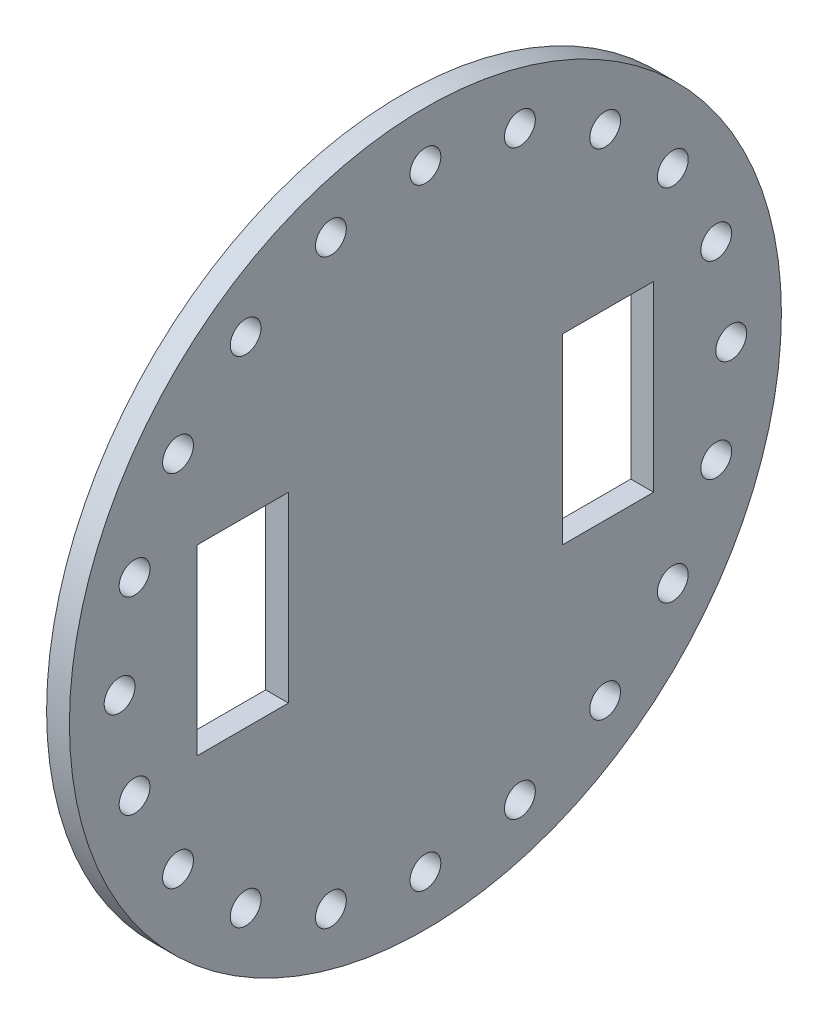
ISO-10303-21;
HEADER;
FILE_DESCRIPTION(('STEP AP214'),'2;1');
FILE_NAME('part.step','',(''),(''),'','','');
FILE_SCHEMA(('AUTOMOTIVE_DESIGN { 1 0 10303 214 1 1 1 1 }'));
ENDSEC;
DATA;
#1=APPLICATION_CONTEXT('core data for automotive mechanical design processes');
#2=APPLICATION_PROTOCOL_DEFINITION('international standard','automotive_design',2000,#1);
#3=PRODUCT_CONTEXT('',#1,'mechanical');
#4=PRODUCT('Part','Part','',(#3));
#5=PRODUCT_RELATED_PRODUCT_CATEGORY('part','',(#4));
#6=PRODUCT_DEFINITION_FORMATION('','',#4);
#7=PRODUCT_DEFINITION_CONTEXT('part definition',#1,'design');
#8=PRODUCT_DEFINITION('design','',#6,#7);
#9=PRODUCT_DEFINITION_SHAPE('','',#8);
#10=(LENGTH_UNIT() NAMED_UNIT(*) SI_UNIT(.MILLI.,.METRE.));
#11=(NAMED_UNIT(*) PLANE_ANGLE_UNIT() SI_UNIT($,.RADIAN.));
#12=(NAMED_UNIT(*) SI_UNIT($,.STERADIAN.) SOLID_ANGLE_UNIT());
#13=UNCERTAINTY_MEASURE_WITH_UNIT(LENGTH_MEASURE(1.E-05),#10,'distance_accuracy_value','');
#14=(GEOMETRIC_REPRESENTATION_CONTEXT(3) GLOBAL_UNCERTAINTY_ASSIGNED_CONTEXT((#13)) GLOBAL_UNIT_ASSIGNED_CONTEXT((#10,
#11,#12)) REPRESENTATION_CONTEXT('',''));
#15=CARTESIAN_POINT('',(0.,0.,0.));
#16=DIRECTION('',(0.,0.,1.));
#17=DIRECTION('',(1.,0.,0.));
#18=AXIS2_PLACEMENT_3D('',#15,#16,#17);
#19=CARTESIAN_POINT('',(10.,-40.,0.));
#20=DIRECTION('',(0.,1.,0.));
#21=DIRECTION('',(0.,0.,1.));
#22=AXIS2_PLACEMENT_3D('',#19,#20,#21);
#23=PLANE('',#22);
#24=DIRECTION('',(0.,0.,-1.));
#25=VECTOR('',#24,1.);
#26=CARTESIAN_POINT('',(0.,-40.,0.));
#27=LINE('',#26,#25);
#28=CARTESIAN_POINT('',(0.,-40.,100.));
#29=VERTEX_POINT('',#28);
#30=CARTESIAN_POINT('',(0.,-40.,60.));
#31=VERTEX_POINT('',#30);
#32=EDGE_CURVE('E211',#29,#31,#27,.T.);
#33=ORIENTED_EDGE('',*,*,#32,.F.);
#34=DIRECTION('',(-1.,0.,0.));
#35=VECTOR('',#34,1.);
#36=CARTESIAN_POINT('',(10.,-40.,100.));
#37=LINE('',#36,#35);
#38=CARTESIAN_POINT('',(10.,-40.,100.));
#39=VERTEX_POINT('',#38);
#40=EDGE_CURVE('E11',#39,#29,#37,.T.);
#41=ORIENTED_EDGE('',*,*,#40,.F.);
#42=DIRECTION('',(0.,0.,-1.));
#43=VECTOR('',#42,1.);
#44=CARTESIAN_POINT('',(10.,-40.,0.));
#45=LINE('',#44,#43);
#46=CARTESIAN_POINT('',(10.,-40.,60.));
#47=VERTEX_POINT('',#46);
#48=EDGE_CURVE('E128',#39,#47,#45,.T.);
#49=ORIENTED_EDGE('',*,*,#48,.T.);
#50=DIRECTION('',(-1.,0.,0.));
#51=VECTOR('',#50,1.);
#52=CARTESIAN_POINT('',(10.,-40.,60.));
#53=LINE('',#52,#51);
#54=EDGE_CURVE('E89',#47,#31,#53,.T.);
#55=ORIENTED_EDGE('',*,*,#54,.T.);
#56=EDGE_LOOP('',(#33,#41,#49,#55));
#57=FACE_BOUND('',#56,.T.);
#58=ADVANCED_FACE('F35',(#57),#23,.T.);
#59=CARTESIAN_POINT('',(10.,0.,100.));
#60=DIRECTION('',(0.,0.,-1.));
#61=DIRECTION('',(-1.,0.,0.));
#62=AXIS2_PLACEMENT_3D('',#59,#60,#61);
#63=PLANE('',#62);
#64=DIRECTION('',(0.,-1.,0.));
#65=VECTOR('',#64,1.);
#66=CARTESIAN_POINT('',(0.,0.,100.));
#67=LINE('',#66,#65);
#68=CARTESIAN_POINT('',(0.,40.,100.));
#69=VERTEX_POINT('',#68);
#70=EDGE_CURVE('E117',#69,#29,#67,.T.);
#71=ORIENTED_EDGE('',*,*,#70,.F.);
#72=DIRECTION('',(-1.,0.,0.));
#73=VECTOR('',#72,1.);
#74=CARTESIAN_POINT('',(10.,40.,100.));
#75=LINE('',#74,#73);
#76=CARTESIAN_POINT('',(10.,40.,100.));
#77=VERTEX_POINT('',#76);
#78=EDGE_CURVE('E45',#77,#69,#75,.T.);
#79=ORIENTED_EDGE('',*,*,#78,.F.);
#80=DIRECTION('',(0.,-1.,0.));
#81=VECTOR('',#80,1.);
#82=CARTESIAN_POINT('',(10.,0.,100.));
#83=LINE('',#82,#81);
#84=EDGE_CURVE('E115',#77,#39,#83,.T.);
#85=ORIENTED_EDGE('',*,*,#84,.T.);
#86=ORIENTED_EDGE('',*,*,#40,.T.);
#87=EDGE_LOOP('',(#71,#79,#85,#86));
#88=FACE_BOUND('',#87,.T.);
#89=ADVANCED_FACE('F113',(#88),#63,.T.);
#90=CARTESIAN_POINT('',(10.,40.,0.));
#91=DIRECTION('',(0.,1.,0.));
#92=DIRECTION('',(0.,0.,1.));
#93=AXIS2_PLACEMENT_3D('',#90,#91,#92);
#94=PLANE('',#93);
#95=DIRECTION('',(0.,0.,-1.));
#96=VECTOR('',#95,1.);
#97=CARTESIAN_POINT('',(0.,40.,0.));
#98=LINE('',#97,#96);
#99=CARTESIAN_POINT('',(0.,40.,60.));
#100=VERTEX_POINT('',#99);
#101=EDGE_CURVE('E214',#69,#100,#98,.T.);
#102=ORIENTED_EDGE('',*,*,#101,.T.);
#103=DIRECTION('',(-1.,0.,0.));
#104=VECTOR('',#103,1.);
#105=CARTESIAN_POINT('',(10.,40.,60.));
#106=LINE('',#105,#104);
#107=CARTESIAN_POINT('',(10.,40.,60.));
#108=VERTEX_POINT('',#107);
#109=EDGE_CURVE('E120',#108,#100,#106,.T.);
#110=ORIENTED_EDGE('',*,*,#109,.F.);
#111=DIRECTION('',(0.,0.,-1.));
#112=VECTOR('',#111,1.);
#113=CARTESIAN_POINT('',(10.,40.,0.));
#114=LINE('',#113,#112);
#115=EDGE_CURVE('E123',#77,#108,#114,.T.);
#116=ORIENTED_EDGE('',*,*,#115,.F.);
#117=ORIENTED_EDGE('',*,*,#78,.T.);
#118=EDGE_LOOP('',(#102,#110,#116,#117));
#119=FACE_BOUND('',#118,.T.);
#120=ADVANCED_FACE('F124',(#119),#94,.F.);
#121=CARTESIAN_POINT('',(10.,0.,-60.));
#122=DIRECTION('',(0.,0.,-1.));
#123=DIRECTION('',(-1.,0.,0.));
#124=AXIS2_PLACEMENT_3D('',#121,#122,#123);
#125=PLANE('',#124);
#126=DIRECTION('',(0.,-1.,0.));
#127=VECTOR('',#126,1.);
#128=CARTESIAN_POINT('',(0.,0.,-60.));
#129=LINE('',#128,#127);
#130=CARTESIAN_POINT('',(0.,40.,-60.));
#131=VERTEX_POINT('',#130);
#132=CARTESIAN_POINT('',(0.,-40.,-60.));
#133=VERTEX_POINT('',#132);
#134=EDGE_CURVE('E199',#131,#133,#129,.T.);
#135=ORIENTED_EDGE('',*,*,#134,.F.);
#136=DIRECTION('',(-1.,0.,0.));
#137=VECTOR('',#136,1.);
#138=CARTESIAN_POINT('',(10.,40.,-60.));
#139=LINE('',#138,#137);
#140=CARTESIAN_POINT('',(10.,40.,-60.));
#141=VERTEX_POINT('',#140);
#142=EDGE_CURVE('E39',#141,#131,#139,.T.);
#143=ORIENTED_EDGE('',*,*,#142,.F.);
#144=DIRECTION('',(0.,-1.,0.));
#145=VECTOR('',#144,1.);
#146=CARTESIAN_POINT('',(10.,0.,-60.));
#147=LINE('',#146,#145);
#148=CARTESIAN_POINT('',(10.,-40.,-60.));
#149=VERTEX_POINT('',#148);
#150=EDGE_CURVE('E248',#141,#149,#147,.T.);
#151=ORIENTED_EDGE('',*,*,#150,.T.);
#152=DIRECTION('',(-1.,0.,0.));
#153=VECTOR('',#152,1.);
#154=CARTESIAN_POINT('',(10.,-40.,-60.));
#155=LINE('',#154,#153);
#156=EDGE_CURVE('E138',#149,#133,#155,.T.);
#157=ORIENTED_EDGE('',*,*,#156,.T.);
#158=EDGE_LOOP('',(#135,#143,#151,#157));
#159=FACE_BOUND('',#158,.T.);
#160=ADVANCED_FACE('F236',(#159),#125,.T.);
#161=CARTESIAN_POINT('',(10.,40.,0.));
#162=DIRECTION('',(0.,-1.,0.));
#163=DIRECTION('',(0.,0.,-1.));
#164=AXIS2_PLACEMENT_3D('',#161,#162,#163);
#165=PLANE('',#164);
#166=DIRECTION('',(0.,0.,1.));
#167=VECTOR('',#166,1.);
#168=CARTESIAN_POINT('',(0.,40.,0.));
#169=LINE('',#168,#167);
#170=CARTESIAN_POINT('',(0.,40.,-100.));
#171=VERTEX_POINT('',#170);
#172=EDGE_CURVE('E202',#171,#131,#169,.T.);
#173=ORIENTED_EDGE('',*,*,#172,.F.);
#174=DIRECTION('',(-1.,0.,0.));
#175=VECTOR('',#174,1.);
#176=CARTESIAN_POINT('',(10.,40.,-100.));
#177=LINE('',#176,#175);
#178=CARTESIAN_POINT('',(10.,40.,-100.));
#179=VERTEX_POINT('',#178);
#180=EDGE_CURVE('E226',#179,#171,#177,.T.);
#181=ORIENTED_EDGE('',*,*,#180,.F.);
#182=DIRECTION('',(0.,0.,1.));
#183=VECTOR('',#182,1.);
#184=CARTESIAN_POINT('',(10.,40.,0.));
#185=LINE('',#184,#183);
#186=EDGE_CURVE('E235',#179,#141,#185,.T.);
#187=ORIENTED_EDGE('',*,*,#186,.T.);
#188=ORIENTED_EDGE('',*,*,#142,.T.);
#189=EDGE_LOOP('',(#173,#181,#187,#188));
#190=FACE_BOUND('',#189,.T.);
#191=ADVANCED_FACE('F233',(#190),#165,.T.);
#192=CARTESIAN_POINT('',(10.,0.,-100.));
#193=DIRECTION('',(0.,0.,-1.));
#194=DIRECTION('',(-1.,0.,0.));
#195=AXIS2_PLACEMENT_3D('',#192,#193,#194);
#196=PLANE('',#195);
#197=DIRECTION('',(0.,-1.,0.));
#198=VECTOR('',#197,1.);
#199=CARTESIAN_POINT('',(0.,0.,-100.));
#200=LINE('',#199,#198);
#201=CARTESIAN_POINT('',(0.,-40.,-100.));
#202=VERTEX_POINT('',#201);
#203=EDGE_CURVE('E205',#171,#202,#200,.T.);
#204=ORIENTED_EDGE('',*,*,#203,.T.);
#205=DIRECTION('',(-1.,0.,0.));
#206=VECTOR('',#205,1.);
#207=CARTESIAN_POINT('',(10.,-40.,-100.));
#208=LINE('',#207,#206);
#209=CARTESIAN_POINT('',(10.,-40.,-100.));
#210=VERTEX_POINT('',#209);
#211=EDGE_CURVE('E224',#210,#202,#208,.T.);
#212=ORIENTED_EDGE('',*,*,#211,.F.);
#213=DIRECTION('',(0.,-1.,0.));
#214=VECTOR('',#213,1.);
#215=CARTESIAN_POINT('',(10.,0.,-100.));
#216=LINE('',#215,#214);
#217=EDGE_CURVE('E243',#179,#210,#216,.T.);
#218=ORIENTED_EDGE('',*,*,#217,.F.);
#219=ORIENTED_EDGE('',*,*,#180,.T.);
#220=EDGE_LOOP('',(#204,#212,#218,#219));
#221=FACE_BOUND('',#220,.T.);
#222=ADVANCED_FACE('F241',(#221),#196,.F.);
#223=CARTESIAN_POINT('',(10.,0.,60.));
#224=DIRECTION('',(0.,0.,-1.));
#225=DIRECTION('',(-1.,0.,0.));
#226=AXIS2_PLACEMENT_3D('',#223,#224,#225);
#227=PLANE('',#226);
#228=DIRECTION('',(0.,-1.,0.));
#229=VECTOR('',#228,1.);
#230=CARTESIAN_POINT('',(0.,0.,60.));
#231=LINE('',#230,#229);
#232=EDGE_CURVE('E82',#100,#31,#231,.T.);
#233=ORIENTED_EDGE('',*,*,#232,.T.);
#234=ORIENTED_EDGE('',*,*,#54,.F.);
#235=DIRECTION('',(0.,-1.,0.));
#236=VECTOR('',#235,1.);
#237=CARTESIAN_POINT('',(10.,0.,60.));
#238=LINE('',#237,#236);
#239=EDGE_CURVE('E54',#108,#47,#238,.T.);
#240=ORIENTED_EDGE('',*,*,#239,.F.);
#241=ORIENTED_EDGE('',*,*,#109,.T.);
#242=EDGE_LOOP('',(#233,#234,#240,#241));
#243=FACE_BOUND('',#242,.T.);
#244=ADVANCED_FACE('F380',(#243),#227,.F.);
#245=CARTESIAN_POINT('',(10.,-40.,0.));
#246=DIRECTION('',(0.,-1.,0.));
#247=DIRECTION('',(0.,0.,-1.));
#248=AXIS2_PLACEMENT_3D('',#245,#246,#247);
#249=PLANE('',#248);
#250=DIRECTION('',(0.,0.,1.));
#251=VECTOR('',#250,1.);
#252=CARTESIAN_POINT('',(0.,-40.,0.));
#253=LINE('',#252,#251);
#254=EDGE_CURVE('E208',#202,#133,#253,.T.);
#255=ORIENTED_EDGE('',*,*,#254,.T.);
#256=ORIENTED_EDGE('',*,*,#156,.F.);
#257=DIRECTION('',(0.,0.,1.));
#258=VECTOR('',#257,1.);
#259=CARTESIAN_POINT('',(10.,-40.,0.));
#260=LINE('',#259,#258);
#261=EDGE_CURVE('E130',#210,#149,#260,.T.);
#262=ORIENTED_EDGE('',*,*,#261,.F.);
#263=ORIENTED_EDGE('',*,*,#211,.T.);
#264=EDGE_LOOP('',(#255,#256,#262,#263));
#265=FACE_BOUND('',#264,.T.);
#266=ADVANCED_FACE('F245',(#265),#249,.F.);
#267=CARTESIAN_POINT('',(10.,-41.4082772462431,-127.441573183551));
#268=DIRECTION('',(-1.,0.,0.));
#269=DIRECTION('',(0.,0.,1.));
#270=AXIS2_PLACEMENT_3D('',#267,#268,#269);
#271=CYLINDRICAL_SURFACE('',#270,6.75000000000003);
#272=CARTESIAN_POINT('',(10.,-41.4082772462431,-127.441573183551));
#273=DIRECTION('',(1.,0.,0.));
#274=DIRECTION('',(0.,0.,-1.));
#275=AXIS2_PLACEMENT_3D('',#272,#273,#274);
#276=CIRCLE('',#275,6.75000000000003);
#277=CARTESIAN_POINT('',(10.,-41.4082772462431,-134.191573183551));
#278=VERTEX_POINT('',#277);
#279=EDGE_CURVE('E252',#278,#278,#276,.T.);
#280=ORIENTED_EDGE('',*,*,#279,.T.);
#281=EDGE_LOOP('',(#280));
#282=FACE_BOUND('',#281,.T.);
#283=CARTESIAN_POINT('',(0.,-41.4082772462431,-127.441573183551));
#284=DIRECTION('',(1.,0.,0.));
#285=DIRECTION('',(0.,0.,-1.));
#286=AXIS2_PLACEMENT_3D('',#283,#284,#285);
#287=CIRCLE('',#286,6.75000000000003);
#288=CARTESIAN_POINT('',(0.,-41.4082772462431,-134.191573183551));
#289=VERTEX_POINT('',#288);
#290=EDGE_CURVE('E196',#289,#289,#287,.T.);
#291=ORIENTED_EDGE('',*,*,#290,.F.);
#292=EDGE_LOOP('',(#291));
#293=FACE_BOUND('',#292,.T.);
#294=ADVANCED_FACE('F356',(#282,#293),#271,.F.);
#295=CARTESIAN_POINT('',(10.,0.,-134.));
#296=DIRECTION('',(-1.,0.,0.));
#297=DIRECTION('',(0.,0.,1.));
#298=AXIS2_PLACEMENT_3D('',#295,#296,#297);
#299=CYLINDRICAL_SURFACE('',#298,6.75000000000003);
#300=CARTESIAN_POINT('',(10.,0.,-134.));
#301=DIRECTION('',(1.,0.,0.));
#302=DIRECTION('',(0.,0.,-1.));
#303=AXIS2_PLACEMENT_3D('',#300,#301,#302);
#304=CIRCLE('',#303,6.75000000000003);
#305=CARTESIAN_POINT('',(10.,0.,-140.75));
#306=VERTEX_POINT('',#305);
#307=EDGE_CURVE('E255',#306,#306,#304,.T.);
#308=ORIENTED_EDGE('',*,*,#307,.T.);
#309=EDGE_LOOP('',(#308));
#310=FACE_BOUND('',#309,.T.);
#311=CARTESIAN_POINT('',(0.,0.,-134.));
#312=DIRECTION('',(1.,0.,0.));
#313=DIRECTION('',(0.,0.,-1.));
#314=AXIS2_PLACEMENT_3D('',#311,#312,#313);
#315=CIRCLE('',#314,6.75000000000003);
#316=CARTESIAN_POINT('',(0.,0.,-140.75));
#317=VERTEX_POINT('',#316);
#318=EDGE_CURVE('E193',#317,#317,#315,.T.);
#319=ORIENTED_EDGE('',*,*,#318,.F.);
#320=EDGE_LOOP('',(#319));
#321=FACE_BOUND('',#320,.T.);
#322=ADVANCED_FACE('F359',(#310,#321),#299,.F.);
#323=CARTESIAN_POINT('',(10.,-78.7632238071916,-108.408277246243));
#324=DIRECTION('',(-1.,0.,0.));
#325=DIRECTION('',(0.,0.,1.));
#326=AXIS2_PLACEMENT_3D('',#323,#324,#325);
#327=CYLINDRICAL_SURFACE('',#326,6.75000000000003);
#328=CARTESIAN_POINT('',(10.,-78.7632238071916,-108.408277246243));
#329=DIRECTION('',(1.,0.,0.));
#330=DIRECTION('',(0.,0.,-1.));
#331=AXIS2_PLACEMENT_3D('',#328,#329,#330);
#332=CIRCLE('',#331,6.75000000000003);
#333=CARTESIAN_POINT('',(10.,-78.7632238071916,-115.158277246243));
#334=VERTEX_POINT('',#333);
#335=EDGE_CURVE('E258',#334,#334,#332,.T.);
#336=ORIENTED_EDGE('',*,*,#335,.T.);
#337=EDGE_LOOP('',(#336));
#338=FACE_BOUND('',#337,.T.);
#339=CARTESIAN_POINT('',(0.,-78.7632238071916,-108.408277246243));
#340=DIRECTION('',(1.,0.,0.));
#341=DIRECTION('',(0.,0.,-1.));
#342=AXIS2_PLACEMENT_3D('',#339,#340,#341);
#343=CIRCLE('',#342,6.75000000000003);
#344=CARTESIAN_POINT('',(0.,-78.7632238071916,-115.158277246243));
#345=VERTEX_POINT('',#344);
#346=EDGE_CURVE('E190',#345,#345,#343,.T.);
#347=ORIENTED_EDGE('',*,*,#346,.F.);
#348=EDGE_LOOP('',(#347));
#349=FACE_BOUND('',#348,.T.);
#350=ADVANCED_FACE('F389',(#338,#349),#327,.F.);
#351=CARTESIAN_POINT('',(10.,-108.408277246243,-78.7632238071912));
#352=DIRECTION('',(-1.,0.,0.));
#353=DIRECTION('',(0.,0.,1.));
#354=AXIS2_PLACEMENT_3D('',#351,#352,#353);
#355=CYLINDRICAL_SURFACE('',#354,6.75000000000005);
#356=CARTESIAN_POINT('',(10.,-108.408277246243,-78.7632238071912));
#357=DIRECTION('',(1.,0.,0.));
#358=DIRECTION('',(0.,0.,-1.));
#359=AXIS2_PLACEMENT_3D('',#356,#357,#358);
#360=CIRCLE('',#359,6.75000000000005);
#361=CARTESIAN_POINT('',(10.,-108.408277246243,-85.5132238071912));
#362=VERTEX_POINT('',#361);
#363=EDGE_CURVE('E261',#362,#362,#360,.T.);
#364=ORIENTED_EDGE('',*,*,#363,.T.);
#365=EDGE_LOOP('',(#364));
#366=FACE_BOUND('',#365,.T.);
#367=CARTESIAN_POINT('',(0.,-108.408277246243,-78.7632238071912));
#368=DIRECTION('',(1.,0.,0.));
#369=DIRECTION('',(0.,0.,-1.));
#370=AXIS2_PLACEMENT_3D('',#367,#368,#369);
#371=CIRCLE('',#370,6.75000000000005);
#372=CARTESIAN_POINT('',(0.,-108.408277246243,-85.5132238071912));
#373=VERTEX_POINT('',#372);
#374=EDGE_CURVE('E187',#373,#373,#371,.T.);
#375=ORIENTED_EDGE('',*,*,#374,.F.);
#376=EDGE_LOOP('',(#375));
#377=FACE_BOUND('',#376,.T.);
#378=ADVANCED_FACE('F393',(#366,#377),#355,.F.);
#379=CARTESIAN_POINT('',(10.,-127.441573183551,-41.4082772462426));
#380=DIRECTION('',(-1.,0.,0.));
#381=DIRECTION('',(0.,0.,1.));
#382=AXIS2_PLACEMENT_3D('',#379,#380,#381);
#383=CYLINDRICAL_SURFACE('',#382,6.75000000000003);
#384=CARTESIAN_POINT('',(10.,-127.441573183551,-41.4082772462426));
#385=DIRECTION('',(1.,0.,0.));
#386=DIRECTION('',(0.,0.,-1.));
#387=AXIS2_PLACEMENT_3D('',#384,#385,#386);
#388=CIRCLE('',#387,6.75000000000003);
#389=CARTESIAN_POINT('',(10.,-127.441573183551,-48.1582772462426));
#390=VERTEX_POINT('',#389);
#391=EDGE_CURVE('E264',#390,#390,#388,.T.);
#392=ORIENTED_EDGE('',*,*,#391,.T.);
#393=EDGE_LOOP('',(#392));
#394=FACE_BOUND('',#393,.T.);
#395=CARTESIAN_POINT('',(0.,-127.441573183551,-41.4082772462426));
#396=DIRECTION('',(1.,0.,0.));
#397=DIRECTION('',(0.,0.,-1.));
#398=AXIS2_PLACEMENT_3D('',#395,#396,#397);
#399=CIRCLE('',#398,6.75000000000003);
#400=CARTESIAN_POINT('',(0.,-127.441573183551,-48.1582772462426));
#401=VERTEX_POINT('',#400);
#402=EDGE_CURVE('E184',#401,#401,#399,.T.);
#403=ORIENTED_EDGE('',*,*,#402,.F.);
#404=EDGE_LOOP('',(#403));
#405=FACE_BOUND('',#404,.T.);
#406=ADVANCED_FACE('F397',(#394,#405),#383,.F.);
#407=CARTESIAN_POINT('',(10.,-134.,4.68375338513738E-13));
#408=DIRECTION('',(-1.,0.,0.));
#409=DIRECTION('',(0.,0.,1.));
#410=AXIS2_PLACEMENT_3D('',#407,#408,#409);
#411=CYLINDRICAL_SURFACE('',#410,6.75000000000002);
#412=CARTESIAN_POINT('',(10.,-134.,4.68375338513738E-13));
#413=DIRECTION('',(1.,0.,0.));
#414=DIRECTION('',(0.,0.,-1.));
#415=AXIS2_PLACEMENT_3D('',#412,#413,#414);
#416=CIRCLE('',#415,6.75000000000002);
#417=CARTESIAN_POINT('',(10.,-134.,-6.74999999999955));
#418=VERTEX_POINT('',#417);
#419=EDGE_CURVE('E267',#418,#418,#416,.T.);
#420=ORIENTED_EDGE('',*,*,#419,.T.);
#421=EDGE_LOOP('',(#420));
#422=FACE_BOUND('',#421,.T.);
#423=CARTESIAN_POINT('',(0.,-134.,4.68375338513738E-13));
#424=DIRECTION('',(1.,0.,0.));
#425=DIRECTION('',(0.,0.,-1.));
#426=AXIS2_PLACEMENT_3D('',#423,#424,#425);
#427=CIRCLE('',#426,6.75000000000002);
#428=CARTESIAN_POINT('',(0.,-134.,-6.74999999999955));
#429=VERTEX_POINT('',#428);
#430=EDGE_CURVE('E181',#429,#429,#427,.T.);
#431=ORIENTED_EDGE('',*,*,#430,.F.);
#432=EDGE_LOOP('',(#431));
#433=FACE_BOUND('',#432,.T.);
#434=ADVANCED_FACE('F401',(#422,#433),#411,.F.);
#435=CARTESIAN_POINT('',(10.,-127.44157318355,41.4082772462435));
#436=DIRECTION('',(-1.,0.,0.));
#437=DIRECTION('',(0.,0.,1.));
#438=AXIS2_PLACEMENT_3D('',#435,#436,#437);
#439=CYLINDRICAL_SURFACE('',#438,6.75000000000003);
#440=CARTESIAN_POINT('',(10.,-127.44157318355,41.4082772462435));
#441=DIRECTION('',(1.,0.,0.));
#442=DIRECTION('',(0.,0.,-1.));
#443=AXIS2_PLACEMENT_3D('',#440,#441,#442);
#444=CIRCLE('',#443,6.75000000000003);
#445=CARTESIAN_POINT('',(10.,-127.44157318355,34.6582772462435));
#446=VERTEX_POINT('',#445);
#447=EDGE_CURVE('E270',#446,#446,#444,.T.);
#448=ORIENTED_EDGE('',*,*,#447,.T.);
#449=EDGE_LOOP('',(#448));
#450=FACE_BOUND('',#449,.T.);
#451=CARTESIAN_POINT('',(0.,-127.44157318355,41.4082772462435));
#452=DIRECTION('',(1.,0.,0.));
#453=DIRECTION('',(0.,0.,-1.));
#454=AXIS2_PLACEMENT_3D('',#451,#452,#453);
#455=CIRCLE('',#454,6.75000000000003);
#456=CARTESIAN_POINT('',(0.,-127.44157318355,34.6582772462435));
#457=VERTEX_POINT('',#456);
#458=EDGE_CURVE('E178',#457,#457,#455,.T.);
#459=ORIENTED_EDGE('',*,*,#458,.F.);
#460=EDGE_LOOP('',(#459));
#461=FACE_BOUND('',#460,.T.);
#462=ADVANCED_FACE('F405',(#450,#461),#439,.F.);
#463=CARTESIAN_POINT('',(10.,-108.408277246243,78.7632238071919));
#464=DIRECTION('',(-1.,0.,0.));
#465=DIRECTION('',(0.,0.,1.));
#466=AXIS2_PLACEMENT_3D('',#463,#464,#465);
#467=CYLINDRICAL_SURFACE('',#466,6.75000000000003);
#468=CARTESIAN_POINT('',(10.,-108.408277246243,78.7632238071919));
#469=DIRECTION('',(1.,0.,0.));
#470=DIRECTION('',(0.,0.,-1.));
#471=AXIS2_PLACEMENT_3D('',#468,#469,#470);
#472=CIRCLE('',#471,6.75000000000003);
#473=CARTESIAN_POINT('',(10.,-108.408277246243,72.0132238071919));
#474=VERTEX_POINT('',#473);
#475=EDGE_CURVE('E273',#474,#474,#472,.T.);
#476=ORIENTED_EDGE('',*,*,#475,.T.);
#477=EDGE_LOOP('',(#476));
#478=FACE_BOUND('',#477,.T.);
#479=CARTESIAN_POINT('',(0.,-108.408277246243,78.7632238071919));
#480=DIRECTION('',(1.,0.,0.));
#481=DIRECTION('',(0.,0.,-1.));
#482=AXIS2_PLACEMENT_3D('',#479,#480,#481);
#483=CIRCLE('',#482,6.75000000000003);
#484=CARTESIAN_POINT('',(0.,-108.408277246243,72.0132238071919));
#485=VERTEX_POINT('',#484);
#486=EDGE_CURVE('E175',#485,#485,#483,.T.);
#487=ORIENTED_EDGE('',*,*,#486,.F.);
#488=EDGE_LOOP('',(#487));
#489=FACE_BOUND('',#488,.T.);
#490=ADVANCED_FACE('F409',(#478,#489),#467,.F.);
#491=CARTESIAN_POINT('',(10.,-78.7632238071908,108.408277246243));
#492=DIRECTION('',(-1.,0.,0.));
#493=DIRECTION('',(0.,0.,1.));
#494=AXIS2_PLACEMENT_3D('',#491,#492,#493);
#495=CYLINDRICAL_SURFACE('',#494,6.75000000000003);
#496=CARTESIAN_POINT('',(10.,-78.7632238071908,108.408277246243));
#497=DIRECTION('',(1.,0.,0.));
#498=DIRECTION('',(0.,0.,-1.));
#499=AXIS2_PLACEMENT_3D('',#496,#497,#498);
#500=CIRCLE('',#499,6.75000000000003);
#501=CARTESIAN_POINT('',(10.,-78.7632238071908,101.658277246243));
#502=VERTEX_POINT('',#501);
#503=EDGE_CURVE('E276',#502,#502,#500,.T.);
#504=ORIENTED_EDGE('',*,*,#503,.T.);
#505=EDGE_LOOP('',(#504));
#506=FACE_BOUND('',#505,.T.);
#507=CARTESIAN_POINT('',(0.,-78.7632238071908,108.408277246243));
#508=DIRECTION('',(1.,0.,0.));
#509=DIRECTION('',(0.,0.,-1.));
#510=AXIS2_PLACEMENT_3D('',#507,#508,#509);
#511=CIRCLE('',#510,6.75000000000003);
#512=CARTESIAN_POINT('',(0.,-78.7632238071908,101.658277246243));
#513=VERTEX_POINT('',#512);
#514=EDGE_CURVE('E172',#513,#513,#511,.T.);
#515=ORIENTED_EDGE('',*,*,#514,.F.);
#516=EDGE_LOOP('',(#515));
#517=FACE_BOUND('',#516,.T.);
#518=ADVANCED_FACE('F413',(#506,#517),#495,.F.);
#519=CARTESIAN_POINT('',(10.,-41.4082772462421,127.441573183551));
#520=DIRECTION('',(-1.,0.,0.));
#521=DIRECTION('',(0.,0.,1.));
#522=AXIS2_PLACEMENT_3D('',#519,#520,#521);
#523=CYLINDRICAL_SURFACE('',#522,6.75000000000002);
#524=CARTESIAN_POINT('',(10.,-41.4082772462421,127.441573183551));
#525=DIRECTION('',(1.,0.,0.));
#526=DIRECTION('',(0.,0.,-1.));
#527=AXIS2_PLACEMENT_3D('',#524,#525,#526);
#528=CIRCLE('',#527,6.75000000000002);
#529=CARTESIAN_POINT('',(10.,-41.4082772462421,120.691573183551));
#530=VERTEX_POINT('',#529);
#531=EDGE_CURVE('E279',#530,#530,#528,.T.);
#532=ORIENTED_EDGE('',*,*,#531,.T.);
#533=EDGE_LOOP('',(#532));
#534=FACE_BOUND('',#533,.T.);
#535=CARTESIAN_POINT('',(0.,-41.4082772462421,127.441573183551));
#536=DIRECTION('',(1.,0.,0.));
#537=DIRECTION('',(0.,0.,-1.));
#538=AXIS2_PLACEMENT_3D('',#535,#536,#537);
#539=CIRCLE('',#538,6.75000000000002);
#540=CARTESIAN_POINT('',(0.,-41.4082772462421,120.691573183551));
#541=VERTEX_POINT('',#540);
#542=EDGE_CURVE('E169',#541,#541,#539,.T.);
#543=ORIENTED_EDGE('',*,*,#542,.F.);
#544=EDGE_LOOP('',(#543));
#545=FACE_BOUND('',#544,.T.);
#546=ADVANCED_FACE('F417',(#534,#545),#523,.F.);
#547=CARTESIAN_POINT('',(10.,9.35449634420493E-13,134.));
#548=DIRECTION('',(-1.,0.,0.));
#549=DIRECTION('',(0.,0.,1.));
#550=AXIS2_PLACEMENT_3D('',#547,#548,#549);
#551=CYLINDRICAL_SURFACE('',#550,6.75);
#552=CARTESIAN_POINT('',(10.,9.35449634420493E-13,134.));
#553=DIRECTION('',(1.,0.,0.));
#554=DIRECTION('',(0.,0.,-1.));
#555=AXIS2_PLACEMENT_3D('',#552,#553,#554);
#556=CIRCLE('',#555,6.75);
#557=CARTESIAN_POINT('',(10.,9.35449634420493E-13,127.25));
#558=VERTEX_POINT('',#557);
#559=EDGE_CURVE('E282',#558,#558,#556,.T.);
#560=ORIENTED_EDGE('',*,*,#559,.T.);
#561=EDGE_LOOP('',(#560));
#562=FACE_BOUND('',#561,.T.);
#563=CARTESIAN_POINT('',(0.,9.35449634420493E-13,134.));
#564=DIRECTION('',(1.,0.,0.));
#565=DIRECTION('',(0.,0.,-1.));
#566=AXIS2_PLACEMENT_3D('',#563,#564,#565);
#567=CIRCLE('',#566,6.75);
#568=CARTESIAN_POINT('',(0.,9.35449634420493E-13,127.25));
#569=VERTEX_POINT('',#568);
#570=EDGE_CURVE('E166',#569,#569,#567,.T.);
#571=ORIENTED_EDGE('',*,*,#570,.F.);
#572=EDGE_LOOP('',(#571));
#573=FACE_BOUND('',#572,.T.);
#574=ADVANCED_FACE('F421',(#562,#573),#551,.F.);
#575=CARTESIAN_POINT('',(10.,41.408277246244,127.44157318355));
#576=DIRECTION('',(-1.,0.,0.));
#577=DIRECTION('',(0.,0.,1.));
#578=AXIS2_PLACEMENT_3D('',#575,#576,#577);
#579=CYLINDRICAL_SURFACE('',#578,6.75000000000006);
#580=CARTESIAN_POINT('',(10.,41.408277246244,127.44157318355));
#581=DIRECTION('',(1.,0.,0.));
#582=DIRECTION('',(0.,0.,-1.));
#583=AXIS2_PLACEMENT_3D('',#580,#581,#582);
#584=CIRCLE('',#583,6.75000000000006);
#585=CARTESIAN_POINT('',(10.,41.408277246244,120.69157318355));
#586=VERTEX_POINT('',#585);
#587=EDGE_CURVE('E285',#586,#586,#584,.T.);
#588=ORIENTED_EDGE('',*,*,#587,.T.);
#589=EDGE_LOOP('',(#588));
#590=FACE_BOUND('',#589,.T.);
#591=CARTESIAN_POINT('',(0.,41.408277246244,127.44157318355));
#592=DIRECTION('',(1.,0.,0.));
#593=DIRECTION('',(0.,0.,-1.));
#594=AXIS2_PLACEMENT_3D('',#591,#592,#593);
#595=CIRCLE('',#594,6.75000000000006);
#596=CARTESIAN_POINT('',(0.,41.408277246244,120.69157318355));
#597=VERTEX_POINT('',#596);
#598=EDGE_CURVE('E163',#597,#597,#595,.T.);
#599=ORIENTED_EDGE('',*,*,#598,.F.);
#600=EDGE_LOOP('',(#599));
#601=FACE_BOUND('',#600,.T.);
#602=ADVANCED_FACE('F425',(#590,#601),#579,.F.);
#603=CARTESIAN_POINT('',(10.,78.7632238071924,108.408277246242));
#604=DIRECTION('',(-1.,0.,0.));
#605=DIRECTION('',(0.,0.,1.));
#606=AXIS2_PLACEMENT_3D('',#603,#604,#605);
#607=CYLINDRICAL_SURFACE('',#606,6.75000000000003);
#608=CARTESIAN_POINT('',(10.,78.7632238071924,108.408277246242));
#609=DIRECTION('',(1.,0.,0.));
#610=DIRECTION('',(0.,0.,-1.));
#611=AXIS2_PLACEMENT_3D('',#608,#609,#610);
#612=CIRCLE('',#611,6.75000000000003);
#613=CARTESIAN_POINT('',(10.,78.7632238071924,101.658277246242));
#614=VERTEX_POINT('',#613);
#615=EDGE_CURVE('E288',#614,#614,#612,.T.);
#616=ORIENTED_EDGE('',*,*,#615,.T.);
#617=EDGE_LOOP('',(#616));
#618=FACE_BOUND('',#617,.T.);
#619=CARTESIAN_POINT('',(0.,78.7632238071924,108.408277246242));
#620=DIRECTION('',(1.,0.,0.));
#621=DIRECTION('',(0.,0.,-1.));
#622=AXIS2_PLACEMENT_3D('',#619,#620,#621);
#623=CIRCLE('',#622,6.75000000000003);
#624=CARTESIAN_POINT('',(0.,78.7632238071924,101.658277246242));
#625=VERTEX_POINT('',#624);
#626=EDGE_CURVE('E160',#625,#625,#623,.T.);
#627=ORIENTED_EDGE('',*,*,#626,.F.);
#628=EDGE_LOOP('',(#627));
#629=FACE_BOUND('',#628,.T.);
#630=ADVANCED_FACE('F429',(#618,#629),#607,.F.);
#631=CARTESIAN_POINT('',(10.,108.408277246244,78.7632238071904));
#632=DIRECTION('',(-1.,0.,0.));
#633=DIRECTION('',(0.,0.,1.));
#634=AXIS2_PLACEMENT_3D('',#631,#632,#633);
#635=CYLINDRICAL_SURFACE('',#634,6.75000000000003);
#636=CARTESIAN_POINT('',(10.,108.408277246244,78.7632238071904));
#637=DIRECTION('',(1.,0.,0.));
#638=DIRECTION('',(0.,0.,-1.));
#639=AXIS2_PLACEMENT_3D('',#636,#637,#638);
#640=CIRCLE('',#639,6.75000000000003);
#641=CARTESIAN_POINT('',(10.,108.408277246244,72.0132238071903));
#642=VERTEX_POINT('',#641);
#643=EDGE_CURVE('E291',#642,#642,#640,.T.);
#644=ORIENTED_EDGE('',*,*,#643,.T.);
#645=EDGE_LOOP('',(#644));
#646=FACE_BOUND('',#645,.T.);
#647=CARTESIAN_POINT('',(0.,108.408277246244,78.7632238071904));
#648=DIRECTION('',(1.,0.,0.));
#649=DIRECTION('',(0.,0.,-1.));
#650=AXIS2_PLACEMENT_3D('',#647,#648,#649);
#651=CIRCLE('',#650,6.75000000000003);
#652=CARTESIAN_POINT('',(0.,108.408277246244,72.0132238071903));
#653=VERTEX_POINT('',#652);
#654=EDGE_CURVE('E157',#653,#653,#651,.T.);
#655=ORIENTED_EDGE('',*,*,#654,.F.);
#656=EDGE_LOOP('',(#655));
#657=FACE_BOUND('',#656,.T.);
#658=ADVANCED_FACE('F433',(#646,#657),#635,.F.);
#659=CARTESIAN_POINT('',(10.,127.441573183551,41.4082772462417));
#660=DIRECTION('',(-1.,0.,0.));
#661=DIRECTION('',(0.,0.,1.));
#662=AXIS2_PLACEMENT_3D('',#659,#660,#661);
#663=CYLINDRICAL_SURFACE('',#662,6.75000000000003);
#664=CARTESIAN_POINT('',(10.,127.441573183551,41.4082772462417));
#665=DIRECTION('',(1.,0.,0.));
#666=DIRECTION('',(0.,0.,-1.));
#667=AXIS2_PLACEMENT_3D('',#664,#665,#666);
#668=CIRCLE('',#667,6.75000000000003);
#669=CARTESIAN_POINT('',(10.,127.441573183551,34.6582772462417));
#670=VERTEX_POINT('',#669);
#671=EDGE_CURVE('E294',#670,#670,#668,.T.);
#672=ORIENTED_EDGE('',*,*,#671,.T.);
#673=EDGE_LOOP('',(#672));
#674=FACE_BOUND('',#673,.T.);
#675=CARTESIAN_POINT('',(0.,127.441573183551,41.4082772462417));
#676=DIRECTION('',(1.,0.,0.));
#677=DIRECTION('',(0.,0.,-1.));
#678=AXIS2_PLACEMENT_3D('',#675,#676,#677);
#679=CIRCLE('',#678,6.75000000000003);
#680=CARTESIAN_POINT('',(0.,127.441573183551,34.6582772462417));
#681=VERTEX_POINT('',#680);
#682=EDGE_CURVE('E154',#681,#681,#679,.T.);
#683=ORIENTED_EDGE('',*,*,#682,.F.);
#684=EDGE_LOOP('',(#683));
#685=FACE_BOUND('',#684,.T.);
#686=ADVANCED_FACE('F437',(#674,#685),#663,.F.);
#687=CARTESIAN_POINT('',(10.,134.,-1.40339129206524E-12));
#688=DIRECTION('',(-1.,0.,0.));
#689=DIRECTION('',(0.,0.,1.));
#690=AXIS2_PLACEMENT_3D('',#687,#688,#689);
#691=CYLINDRICAL_SURFACE('',#690,6.75000000000004);
#692=CARTESIAN_POINT('',(10.,134.,-1.40339129206524E-12));
#693=DIRECTION('',(1.,0.,0.));
#694=DIRECTION('',(0.,0.,-1.));
#695=AXIS2_PLACEMENT_3D('',#692,#693,#694);
#696=CIRCLE('',#695,6.75000000000004);
#697=CARTESIAN_POINT('',(10.,134.,-6.75000000000144));
#698=VERTEX_POINT('',#697);
#699=EDGE_CURVE('E297',#698,#698,#696,.T.);
#700=ORIENTED_EDGE('',*,*,#699,.T.);
#701=EDGE_LOOP('',(#700));
#702=FACE_BOUND('',#701,.T.);
#703=CARTESIAN_POINT('',(0.,134.,-1.40339129206524E-12));
#704=DIRECTION('',(1.,0.,0.));
#705=DIRECTION('',(0.,0.,-1.));
#706=AXIS2_PLACEMENT_3D('',#703,#704,#705);
#707=CIRCLE('',#706,6.75000000000004);
#708=CARTESIAN_POINT('',(0.,134.,-6.75000000000144));
#709=VERTEX_POINT('',#708);
#710=EDGE_CURVE('E151',#709,#709,#707,.T.);
#711=ORIENTED_EDGE('',*,*,#710,.F.);
#712=EDGE_LOOP('',(#711));
#713=FACE_BOUND('',#712,.T.);
#714=ADVANCED_FACE('F441',(#702,#713),#691,.F.);
#715=CARTESIAN_POINT('',(10.,127.44157318355,-41.4082772462444));
#716=DIRECTION('',(-1.,0.,0.));
#717=DIRECTION('',(0.,0.,1.));
#718=AXIS2_PLACEMENT_3D('',#715,#716,#717);
#719=CYLINDRICAL_SURFACE('',#718,6.75000000000003);
#720=CARTESIAN_POINT('',(10.,127.44157318355,-41.4082772462444));
#721=DIRECTION('',(1.,0.,0.));
#722=DIRECTION('',(0.,0.,-1.));
#723=AXIS2_PLACEMENT_3D('',#720,#721,#722);
#724=CIRCLE('',#723,6.75000000000003);
#725=CARTESIAN_POINT('',(10.,127.44157318355,-48.1582772462444));
#726=VERTEX_POINT('',#725);
#727=EDGE_CURVE('E300',#726,#726,#724,.T.);
#728=ORIENTED_EDGE('',*,*,#727,.T.);
#729=EDGE_LOOP('',(#728));
#730=FACE_BOUND('',#729,.T.);
#731=CARTESIAN_POINT('',(0.,127.44157318355,-41.4082772462444));
#732=DIRECTION('',(1.,0.,0.));
#733=DIRECTION('',(0.,0.,-1.));
#734=AXIS2_PLACEMENT_3D('',#731,#732,#733);
#735=CIRCLE('',#734,6.75000000000003);
#736=CARTESIAN_POINT('',(0.,127.44157318355,-48.1582772462444));
#737=VERTEX_POINT('',#736);
#738=EDGE_CURVE('E148',#737,#737,#735,.T.);
#739=ORIENTED_EDGE('',*,*,#738,.F.);
#740=EDGE_LOOP('',(#739));
#741=FACE_BOUND('',#740,.T.);
#742=ADVANCED_FACE('F445',(#730,#741),#719,.F.);
#743=CARTESIAN_POINT('',(10.,108.408277246242,-78.7632238071927));
#744=DIRECTION('',(-1.,0.,0.));
#745=DIRECTION('',(0.,0.,1.));
#746=AXIS2_PLACEMENT_3D('',#743,#744,#745);
#747=CYLINDRICAL_SURFACE('',#746,6.75000000000003);
#748=CARTESIAN_POINT('',(10.,108.408277246242,-78.7632238071927));
#749=DIRECTION('',(1.,0.,0.));
#750=DIRECTION('',(0.,0.,-1.));
#751=AXIS2_PLACEMENT_3D('',#748,#749,#750);
#752=CIRCLE('',#751,6.75000000000003);
#753=CARTESIAN_POINT('',(10.,108.408277246242,-85.5132238071927));
#754=VERTEX_POINT('',#753);
#755=EDGE_CURVE('E303',#754,#754,#752,.T.);
#756=ORIENTED_EDGE('',*,*,#755,.T.);
#757=EDGE_LOOP('',(#756));
#758=FACE_BOUND('',#757,.T.);
#759=CARTESIAN_POINT('',(0.,108.408277246242,-78.7632238071927));
#760=DIRECTION('',(1.,0.,0.));
#761=DIRECTION('',(0.,0.,-1.));
#762=AXIS2_PLACEMENT_3D('',#759,#760,#761);
#763=CIRCLE('',#762,6.75000000000003);
#764=CARTESIAN_POINT('',(0.,108.408277246242,-85.5132238071927));
#765=VERTEX_POINT('',#764);
#766=EDGE_CURVE('E145',#765,#765,#763,.T.);
#767=ORIENTED_EDGE('',*,*,#766,.F.);
#768=EDGE_LOOP('',(#767));
#769=FACE_BOUND('',#768,.T.);
#770=ADVANCED_FACE('F449',(#758,#769),#747,.F.);
#771=CARTESIAN_POINT('',(10.,78.76322380719,-108.408277246244));
#772=DIRECTION('',(-1.,0.,0.));
#773=DIRECTION('',(0.,0.,1.));
#774=AXIS2_PLACEMENT_3D('',#771,#772,#773);
#775=CYLINDRICAL_SURFACE('',#774,6.75000000000003);
#776=CARTESIAN_POINT('',(10.,78.76322380719,-108.408277246244));
#777=DIRECTION('',(1.,0.,0.));
#778=DIRECTION('',(0.,0.,-1.));
#779=AXIS2_PLACEMENT_3D('',#776,#777,#778);
#780=CIRCLE('',#779,6.75000000000003);
#781=CARTESIAN_POINT('',(10.,78.76322380719,-115.158277246244));
#782=VERTEX_POINT('',#781);
#783=EDGE_CURVE('E306',#782,#782,#780,.T.);
#784=ORIENTED_EDGE('',*,*,#783,.T.);
#785=EDGE_LOOP('',(#784));
#786=FACE_BOUND('',#785,.T.);
#787=CARTESIAN_POINT('',(0.,78.76322380719,-108.408277246244));
#788=DIRECTION('',(1.,0.,0.));
#789=DIRECTION('',(0.,0.,-1.));
#790=AXIS2_PLACEMENT_3D('',#787,#788,#789);
#791=CIRCLE('',#790,6.75000000000003);
#792=CARTESIAN_POINT('',(0.,78.76322380719,-115.158277246244));
#793=VERTEX_POINT('',#792);
#794=EDGE_CURVE('E142',#793,#793,#791,.T.);
#795=ORIENTED_EDGE('',*,*,#794,.F.);
#796=EDGE_LOOP('',(#795));
#797=FACE_BOUND('',#796,.T.);
#798=ADVANCED_FACE('F452',(#786,#797),#775,.F.);
#799=CARTESIAN_POINT('',(10.,41.4082772462413,-127.441573183551));
#800=DIRECTION('',(-1.,0.,0.));
#801=DIRECTION('',(0.,0.,1.));
#802=AXIS2_PLACEMENT_3D('',#799,#800,#801);
#803=CYLINDRICAL_SURFACE('',#802,6.75000000000003);
#804=CARTESIAN_POINT('',(10.,41.4082772462413,-127.441573183551));
#805=DIRECTION('',(1.,0.,0.));
#806=DIRECTION('',(0.,0.,-1.));
#807=AXIS2_PLACEMENT_3D('',#804,#805,#806);
#808=CIRCLE('',#807,6.75000000000003);
#809=CARTESIAN_POINT('',(10.,41.4082772462413,-134.191573183551));
#810=VERTEX_POINT('',#809);
#811=EDGE_CURVE('E220',#810,#810,#808,.T.);
#812=ORIENTED_EDGE('',*,*,#811,.T.);
#813=EDGE_LOOP('',(#812));
#814=FACE_BOUND('',#813,.T.);
#815=CARTESIAN_POINT('',(0.,41.4082772462413,-127.441573183551));
#816=DIRECTION('',(1.,0.,0.));
#817=DIRECTION('',(0.,0.,-1.));
#818=AXIS2_PLACEMENT_3D('',#815,#816,#817);
#819=CIRCLE('',#818,6.75000000000003);
#820=CARTESIAN_POINT('',(0.,41.4082772462413,-134.191573183551));
#821=VERTEX_POINT('',#820);
#822=EDGE_CURVE('E139',#821,#821,#819,.T.);
#823=ORIENTED_EDGE('',*,*,#822,.F.);
#824=EDGE_LOOP('',(#823));
#825=FACE_BOUND('',#824,.T.);
#826=ADVANCED_FACE('F37',(#814,#825),#803,.F.);
#827=CARTESIAN_POINT('',(10.,0.,0.));
#828=DIRECTION('',(-1.,0.,0.));
#829=DIRECTION('',(0.,0.,1.));
#830=AXIS2_PLACEMENT_3D('',#827,#828,#829);
#831=CYLINDRICAL_SURFACE('',#830,156.);
#832=CARTESIAN_POINT('',(10.,0.,0.));
#833=DIRECTION('',(1.,0.,0.));
#834=DIRECTION('',(0.,0.,-1.));
#835=AXIS2_PLACEMENT_3D('',#832,#833,#834);
#836=CIRCLE('',#835,156.);
#837=CARTESIAN_POINT('',(10.,0.,-156.));
#838=VERTEX_POINT('',#837);
#839=EDGE_CURVE('E135',#838,#838,#836,.T.);
#840=ORIENTED_EDGE('',*,*,#839,.F.);
#841=EDGE_LOOP('',(#840));
#842=FACE_BOUND('',#841,.T.);
#843=CARTESIAN_POINT('',(0.,0.,0.));
#844=DIRECTION('',(1.,0.,0.));
#845=DIRECTION('',(0.,0.,-1.));
#846=AXIS2_PLACEMENT_3D('',#843,#844,#845);
#847=CIRCLE('',#846,156.);
#848=CARTESIAN_POINT('',(0.,0.,-156.));
#849=VERTEX_POINT('',#848);
#850=EDGE_CURVE('E217',#849,#849,#847,.T.);
#851=ORIENTED_EDGE('',*,*,#850,.T.);
#852=EDGE_LOOP('',(#851));
#853=FACE_BOUND('',#852,.T.);
#854=ADVANCED_FACE('F316',(#842,#853),#831,.T.);
#855=CARTESIAN_POINT('',(10.,0.,0.));
#856=DIRECTION('',(1.,0.,0.));
#857=DIRECTION('',(0.,0.,-1.));
#858=AXIS2_PLACEMENT_3D('',#855,#856,#857);
#859=PLANE('',#858);
#860=ORIENTED_EDGE('',*,*,#811,.F.);
#861=EDGE_LOOP('',(#860));
#862=FACE_BOUND('',#861,.T.);
#863=ORIENTED_EDGE('',*,*,#783,.F.);
#864=EDGE_LOOP('',(#863));
#865=FACE_BOUND('',#864,.T.);
#866=ORIENTED_EDGE('',*,*,#755,.F.);
#867=EDGE_LOOP('',(#866));
#868=FACE_BOUND('',#867,.T.);
#869=ORIENTED_EDGE('',*,*,#727,.F.);
#870=EDGE_LOOP('',(#869));
#871=FACE_BOUND('',#870,.T.);
#872=ORIENTED_EDGE('',*,*,#699,.F.);
#873=EDGE_LOOP('',(#872));
#874=FACE_BOUND('',#873,.T.);
#875=ORIENTED_EDGE('',*,*,#671,.F.);
#876=EDGE_LOOP('',(#875));
#877=FACE_BOUND('',#876,.T.);
#878=ORIENTED_EDGE('',*,*,#643,.F.);
#879=EDGE_LOOP('',(#878));
#880=FACE_BOUND('',#879,.T.);
#881=ORIENTED_EDGE('',*,*,#615,.F.);
#882=EDGE_LOOP('',(#881));
#883=FACE_BOUND('',#882,.T.);
#884=ORIENTED_EDGE('',*,*,#587,.F.);
#885=EDGE_LOOP('',(#884));
#886=FACE_BOUND('',#885,.T.);
#887=ORIENTED_EDGE('',*,*,#559,.F.);
#888=EDGE_LOOP('',(#887));
#889=FACE_BOUND('',#888,.T.);
#890=ORIENTED_EDGE('',*,*,#531,.F.);
#891=EDGE_LOOP('',(#890));
#892=FACE_BOUND('',#891,.T.);
#893=ORIENTED_EDGE('',*,*,#503,.F.);
#894=EDGE_LOOP('',(#893));
#895=FACE_BOUND('',#894,.T.);
#896=ORIENTED_EDGE('',*,*,#475,.F.);
#897=EDGE_LOOP('',(#896));
#898=FACE_BOUND('',#897,.T.);
#899=ORIENTED_EDGE('',*,*,#447,.F.);
#900=EDGE_LOOP('',(#899));
#901=FACE_BOUND('',#900,.T.);
#902=ORIENTED_EDGE('',*,*,#419,.F.);
#903=EDGE_LOOP('',(#902));
#904=FACE_BOUND('',#903,.T.);
#905=ORIENTED_EDGE('',*,*,#391,.F.);
#906=EDGE_LOOP('',(#905));
#907=FACE_BOUND('',#906,.T.);
#908=ORIENTED_EDGE('',*,*,#363,.F.);
#909=EDGE_LOOP('',(#908));
#910=FACE_BOUND('',#909,.T.);
#911=ORIENTED_EDGE('',*,*,#335,.F.);
#912=EDGE_LOOP('',(#911));
#913=FACE_BOUND('',#912,.T.);
#914=ORIENTED_EDGE('',*,*,#307,.F.);
#915=EDGE_LOOP('',(#914));
#916=FACE_BOUND('',#915,.T.);
#917=ORIENTED_EDGE('',*,*,#279,.F.);
#918=EDGE_LOOP('',(#917));
#919=FACE_BOUND('',#918,.T.);
#920=ORIENTED_EDGE('',*,*,#150,.F.);
#921=ORIENTED_EDGE('',*,*,#186,.F.);
#922=ORIENTED_EDGE('',*,*,#217,.T.);
#923=ORIENTED_EDGE('',*,*,#261,.T.);
#924=EDGE_LOOP('',(#920,#921,#922,#923));
#925=FACE_BOUND('',#924,.T.);
#926=ORIENTED_EDGE('',*,*,#48,.F.);
#927=ORIENTED_EDGE('',*,*,#84,.F.);
#928=ORIENTED_EDGE('',*,*,#115,.T.);
#929=ORIENTED_EDGE('',*,*,#239,.T.);
#930=EDGE_LOOP('',(#926,#927,#928,#929));
#931=FACE_BOUND('',#930,.T.);
#932=ORIENTED_EDGE('',*,*,#839,.T.);
#933=EDGE_LOOP('',(#932));
#934=FACE_BOUND('',#933,.T.);
#935=ADVANCED_FACE('F126',(#862,#865,#868,#871,#874,#877,#880,#883,#886,#889,#892,#895,#898,
#901,#904,#907,#910,#913,#916,#919,#925,#931,#934),#859,.T.);
#936=CARTESIAN_POINT('',(0.,0.,0.));
#937=DIRECTION('',(1.,0.,0.));
#938=DIRECTION('',(0.,0.,-1.));
#939=AXIS2_PLACEMENT_3D('',#936,#937,#938);
#940=PLANE('',#939);
#941=ORIENTED_EDGE('',*,*,#822,.T.);
#942=EDGE_LOOP('',(#941));
#943=FACE_BOUND('',#942,.T.);
#944=ORIENTED_EDGE('',*,*,#794,.T.);
#945=EDGE_LOOP('',(#944));
#946=FACE_BOUND('',#945,.T.);
#947=ORIENTED_EDGE('',*,*,#766,.T.);
#948=EDGE_LOOP('',(#947));
#949=FACE_BOUND('',#948,.T.);
#950=ORIENTED_EDGE('',*,*,#738,.T.);
#951=EDGE_LOOP('',(#950));
#952=FACE_BOUND('',#951,.T.);
#953=ORIENTED_EDGE('',*,*,#710,.T.);
#954=EDGE_LOOP('',(#953));
#955=FACE_BOUND('',#954,.T.);
#956=ORIENTED_EDGE('',*,*,#682,.T.);
#957=EDGE_LOOP('',(#956));
#958=FACE_BOUND('',#957,.T.);
#959=ORIENTED_EDGE('',*,*,#654,.T.);
#960=EDGE_LOOP('',(#959));
#961=FACE_BOUND('',#960,.T.);
#962=ORIENTED_EDGE('',*,*,#626,.T.);
#963=EDGE_LOOP('',(#962));
#964=FACE_BOUND('',#963,.T.);
#965=ORIENTED_EDGE('',*,*,#598,.T.);
#966=EDGE_LOOP('',(#965));
#967=FACE_BOUND('',#966,.T.);
#968=ORIENTED_EDGE('',*,*,#570,.T.);
#969=EDGE_LOOP('',(#968));
#970=FACE_BOUND('',#969,.T.);
#971=ORIENTED_EDGE('',*,*,#542,.T.);
#972=EDGE_LOOP('',(#971));
#973=FACE_BOUND('',#972,.T.);
#974=ORIENTED_EDGE('',*,*,#514,.T.);
#975=EDGE_LOOP('',(#974));
#976=FACE_BOUND('',#975,.T.);
#977=ORIENTED_EDGE('',*,*,#486,.T.);
#978=EDGE_LOOP('',(#977));
#979=FACE_BOUND('',#978,.T.);
#980=ORIENTED_EDGE('',*,*,#458,.T.);
#981=EDGE_LOOP('',(#980));
#982=FACE_BOUND('',#981,.T.);
#983=ORIENTED_EDGE('',*,*,#430,.T.);
#984=EDGE_LOOP('',(#983));
#985=FACE_BOUND('',#984,.T.);
#986=ORIENTED_EDGE('',*,*,#402,.T.);
#987=EDGE_LOOP('',(#986));
#988=FACE_BOUND('',#987,.T.);
#989=ORIENTED_EDGE('',*,*,#374,.T.);
#990=EDGE_LOOP('',(#989));
#991=FACE_BOUND('',#990,.T.);
#992=ORIENTED_EDGE('',*,*,#346,.T.);
#993=EDGE_LOOP('',(#992));
#994=FACE_BOUND('',#993,.T.);
#995=ORIENTED_EDGE('',*,*,#318,.T.);
#996=EDGE_LOOP('',(#995));
#997=FACE_BOUND('',#996,.T.);
#998=ORIENTED_EDGE('',*,*,#290,.T.);
#999=EDGE_LOOP('',(#998));
#1000=FACE_BOUND('',#999,.T.);
#1001=ORIENTED_EDGE('',*,*,#134,.T.);
#1002=ORIENTED_EDGE('',*,*,#254,.F.);
#1003=ORIENTED_EDGE('',*,*,#203,.F.);
#1004=ORIENTED_EDGE('',*,*,#172,.T.);
#1005=EDGE_LOOP('',(#1001,#1002,#1003,#1004));
#1006=FACE_BOUND('',#1005,.T.);
#1007=ORIENTED_EDGE('',*,*,#32,.T.);
#1008=ORIENTED_EDGE('',*,*,#232,.F.);
#1009=ORIENTED_EDGE('',*,*,#101,.F.);
#1010=ORIENTED_EDGE('',*,*,#70,.T.);
#1011=EDGE_LOOP('',(#1007,#1008,#1009,#1010));
#1012=FACE_BOUND('',#1011,.T.);
#1013=ORIENTED_EDGE('',*,*,#850,.F.);
#1014=EDGE_LOOP('',(#1013));
#1015=FACE_BOUND('',#1014,.T.);
#1016=ADVANCED_FACE('F239',(#943,#946,#949,#952,#955,#958,#961,#964,#967,#970,#973,#976,#979,
#982,#985,#988,#991,#994,#997,#1000,#1006,#1012,#1015),#940,.F.);
#1017=CLOSED_SHELL('',(#58,#89,#120,#160,#191,#222,#244,#266,#294,#322,#350,#378,#406,#434,#462,
#490,#518,#546,#574,#602,#630,#658,#686,#714,#742,#770,#798,#826,#854,#935,#1016));
#1018=MANIFOLD_SOLID_BREP('B2',#1017);
#1019=ADVANCED_BREP_SHAPE_REPRESENTATION('',(#18,#1018),#14);
#1020=SHAPE_DEFINITION_REPRESENTATION(#9,#1019);
ENDSEC;
END-ISO-10303-21;
